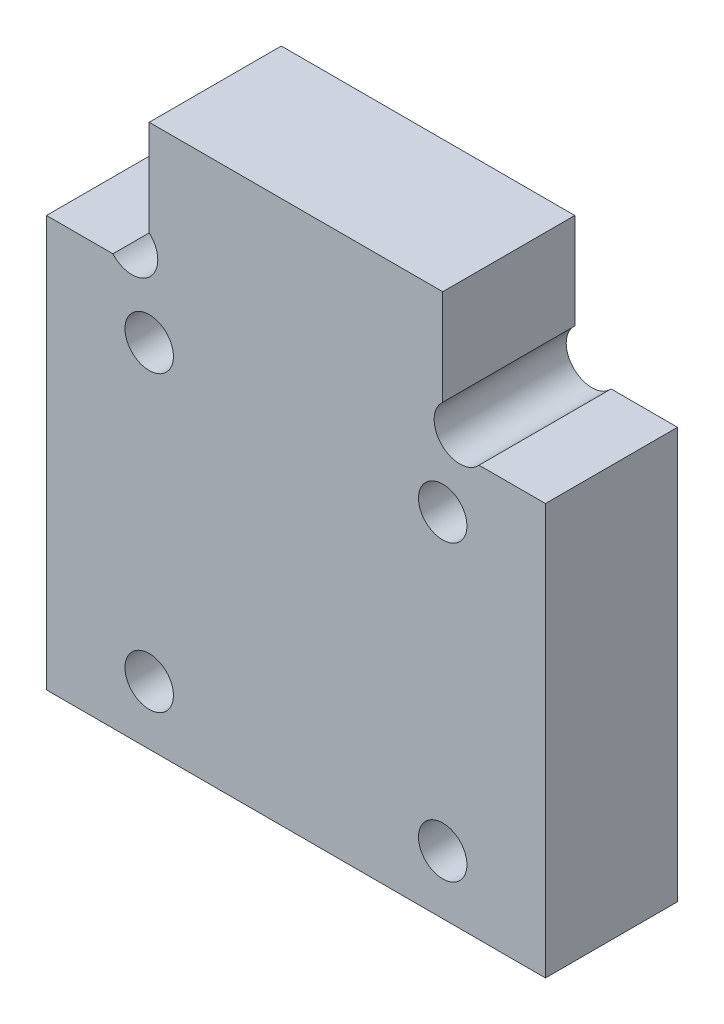
ISO-10303-21;
HEADER;
FILE_DESCRIPTION(('STEP AP214'),'2;1');
FILE_NAME('part.step','',(''),(''),'','','');
FILE_SCHEMA(('AUTOMOTIVE_DESIGN { 1 0 10303 214 1 1 1 1 }'));
ENDSEC;
DATA;
#1=APPLICATION_CONTEXT('core data for automotive mechanical design processes');
#2=APPLICATION_PROTOCOL_DEFINITION('international standard','automotive_design',2000,#1);
#3=PRODUCT_CONTEXT('',#1,'mechanical');
#4=PRODUCT('Part','Part','',(#3));
#5=PRODUCT_RELATED_PRODUCT_CATEGORY('part','',(#4));
#6=PRODUCT_DEFINITION_FORMATION('','',#4);
#7=PRODUCT_DEFINITION_CONTEXT('part definition',#1,'design');
#8=PRODUCT_DEFINITION('design','',#6,#7);
#9=PRODUCT_DEFINITION_SHAPE('','',#8);
#10=(LENGTH_UNIT() NAMED_UNIT(*) SI_UNIT(.MILLI.,.METRE.));
#11=(NAMED_UNIT(*) PLANE_ANGLE_UNIT() SI_UNIT($,.RADIAN.));
#12=(NAMED_UNIT(*) SI_UNIT($,.STERADIAN.) SOLID_ANGLE_UNIT());
#13=UNCERTAINTY_MEASURE_WITH_UNIT(LENGTH_MEASURE(1.E-05),#10,'distance_accuracy_value','');
#14=(GEOMETRIC_REPRESENTATION_CONTEXT(3) GLOBAL_UNCERTAINTY_ASSIGNED_CONTEXT((#13)) GLOBAL_UNIT_ASSIGNED_CONTEXT((#10,
#11,#12)) REPRESENTATION_CONTEXT('',''));
#15=CARTESIAN_POINT('',(0.,0.,0.));
#16=DIRECTION('',(0.,0.,1.));
#17=DIRECTION('',(1.,0.,0.));
#18=AXIS2_PLACEMENT_3D('',#15,#16,#17);
#19=CARTESIAN_POINT('',(0.,28.,9.));
#20=DIRECTION('',(0.,-1.,0.));
#21=DIRECTION('',(0.,0.,-1.));
#22=AXIS2_PLACEMENT_3D('',#19,#20,#21);
#23=PLANE('',#22);
#24=DIRECTION('',(-1.,0.,0.));
#25=VECTOR('',#24,1.);
#26=CARTESIAN_POINT('',(0.,28.,9.));
#27=LINE('',#26,#25);
#28=CARTESIAN_POINT('',(4.52512626584708,28.,9.));
#29=VERTEX_POINT('',#28);
#30=CARTESIAN_POINT('',(0.,28.,9.));
#31=VERTEX_POINT('',#30);
#32=EDGE_CURVE('E128',#29,#31,#27,.T.);
#33=ORIENTED_EDGE('',*,*,#32,.F.);
#34=DIRECTION('',(0.,0.,1.));
#35=VECTOR('',#34,1.);
#36=CARTESIAN_POINT('',(4.52512626584708,28.,0.));
#37=LINE('',#36,#35);
#38=CARTESIAN_POINT('',(4.52512626584708,28.,0.));
#39=VERTEX_POINT('',#38);
#40=EDGE_CURVE('E111',#39,#29,#37,.T.);
#41=ORIENTED_EDGE('',*,*,#40,.F.);
#42=DIRECTION('',(-1.,0.,0.));
#43=VECTOR('',#42,1.);
#44=CARTESIAN_POINT('',(0.,28.,0.));
#45=LINE('',#44,#43);
#46=CARTESIAN_POINT('',(0.,28.,0.));
#47=VERTEX_POINT('',#46);
#48=EDGE_CURVE('E151',#39,#47,#45,.T.);
#49=ORIENTED_EDGE('',*,*,#48,.T.);
#50=DIRECTION('',(0.,0.,-1.));
#51=VECTOR('',#50,1.);
#52=CARTESIAN_POINT('',(0.,28.,9.));
#53=LINE('',#52,#51);
#54=EDGE_CURVE('E134',#31,#47,#53,.T.);
#55=ORIENTED_EDGE('',*,*,#54,.F.);
#56=EDGE_LOOP('',(#33,#41,#49,#55));
#57=FACE_BOUND('',#56,.T.);
#58=ADVANCED_FACE('F33',(#57),#23,.F.);
#59=CARTESIAN_POINT('',(0.,0.,9.));
#60=DIRECTION('',(1.,0.,0.));
#61=DIRECTION('',(0.,0.,-1.));
#62=AXIS2_PLACEMENT_3D('',#59,#60,#61);
#63=PLANE('',#62);
#64=DIRECTION('',(0.,-1.,0.));
#65=VECTOR('',#64,1.);
#66=CARTESIAN_POINT('',(0.,0.,0.));
#67=LINE('',#66,#65);
#68=CARTESIAN_POINT('',(0.,0.,0.));
#69=VERTEX_POINT('',#68);
#70=EDGE_CURVE('E143',#47,#69,#67,.T.);
#71=ORIENTED_EDGE('',*,*,#70,.T.);
#72=DIRECTION('',(0.,0.,-1.));
#73=VECTOR('',#72,1.);
#74=CARTESIAN_POINT('',(0.,0.,9.));
#75=LINE('',#74,#73);
#76=CARTESIAN_POINT('',(0.,0.,9.));
#77=VERTEX_POINT('',#76);
#78=EDGE_CURVE('E11',#77,#69,#75,.T.);
#79=ORIENTED_EDGE('',*,*,#78,.F.);
#80=DIRECTION('',(0.,-1.,0.));
#81=VECTOR('',#80,1.);
#82=CARTESIAN_POINT('',(0.,0.,9.));
#83=LINE('',#82,#81);
#84=EDGE_CURVE('E155',#31,#77,#83,.T.);
#85=ORIENTED_EDGE('',*,*,#84,.F.);
#86=ORIENTED_EDGE('',*,*,#54,.T.);
#87=EDGE_LOOP('',(#71,#79,#85,#86));
#88=FACE_BOUND('',#87,.T.);
#89=ADVANCED_FACE('F35',(#88),#63,.F.);
#90=CARTESIAN_POINT('',(0.,0.,9.));
#91=DIRECTION('',(0.,1.,0.));
#92=DIRECTION('',(0.,0.,1.));
#93=AXIS2_PLACEMENT_3D('',#90,#91,#92);
#94=PLANE('',#93);
#95=DIRECTION('',(1.,0.,0.));
#96=VECTOR('',#95,1.);
#97=CARTESIAN_POINT('',(0.,0.,0.));
#98=LINE('',#97,#96);
#99=CARTESIAN_POINT('',(34.,0.,0.));
#100=VERTEX_POINT('',#99);
#101=EDGE_CURVE('E146',#69,#100,#98,.T.);
#102=ORIENTED_EDGE('',*,*,#101,.T.);
#103=DIRECTION('',(0.,0.,-1.));
#104=VECTOR('',#103,1.);
#105=CARTESIAN_POINT('',(34.,0.,9.));
#106=LINE('',#105,#104);
#107=CARTESIAN_POINT('',(34.,0.,9.));
#108=VERTEX_POINT('',#107);
#109=EDGE_CURVE('E43',#108,#100,#106,.T.);
#110=ORIENTED_EDGE('',*,*,#109,.F.);
#111=DIRECTION('',(1.,0.,0.));
#112=VECTOR('',#111,1.);
#113=CARTESIAN_POINT('',(0.,0.,9.));
#114=LINE('',#113,#112);
#115=EDGE_CURVE('E139',#77,#108,#114,.T.);
#116=ORIENTED_EDGE('',*,*,#115,.F.);
#117=ORIENTED_EDGE('',*,*,#78,.T.);
#118=EDGE_LOOP('',(#102,#110,#116,#117));
#119=FACE_BOUND('',#118,.T.);
#120=ADVANCED_FACE('F264',(#119),#94,.F.);
#121=CARTESIAN_POINT('',(34.,0.,9.));
#122=DIRECTION('',(-1.,0.,0.));
#123=DIRECTION('',(0.,0.,1.));
#124=AXIS2_PLACEMENT_3D('',#121,#122,#123);
#125=PLANE('',#124);
#126=DIRECTION('',(0.,1.,0.));
#127=VECTOR('',#126,1.);
#128=CARTESIAN_POINT('',(34.,0.,0.));
#129=LINE('',#128,#127);
#130=CARTESIAN_POINT('',(34.,28.,0.));
#131=VERTEX_POINT('',#130);
#132=EDGE_CURVE('E149',#100,#131,#129,.T.);
#133=ORIENTED_EDGE('',*,*,#132,.T.);
#134=DIRECTION('',(0.,0.,-1.));
#135=VECTOR('',#134,1.);
#136=CARTESIAN_POINT('',(34.,28.,9.));
#137=LINE('',#136,#135);
#138=CARTESIAN_POINT('',(34.,28.,9.));
#139=VERTEX_POINT('',#138);
#140=EDGE_CURVE('E157',#139,#131,#137,.T.);
#141=ORIENTED_EDGE('',*,*,#140,.F.);
#142=DIRECTION('',(0.,1.,0.));
#143=VECTOR('',#142,1.);
#144=CARTESIAN_POINT('',(34.,0.,9.));
#145=LINE('',#144,#143);
#146=EDGE_CURVE('E137',#108,#139,#145,.T.);
#147=ORIENTED_EDGE('',*,*,#146,.F.);
#148=ORIENTED_EDGE('',*,*,#109,.T.);
#149=EDGE_LOOP('',(#133,#141,#147,#148));
#150=FACE_BOUND('',#149,.T.);
#151=ADVANCED_FACE('F165',(#150),#125,.F.);
#152=CARTESIAN_POINT('',(29.4748737341529,28.,0.));
#153=VERTEX_POINT('',#152);
#154=EDGE_CURVE('E152',#131,#153,#45,.T.);
#155=ORIENTED_EDGE('',*,*,#154,.T.);
#156=DIRECTION('',(0.,0.,1.));
#157=VECTOR('',#156,1.);
#158=CARTESIAN_POINT('',(29.4748737341529,28.,0.));
#159=LINE('',#158,#157);
#160=CARTESIAN_POINT('',(29.4748737341529,28.,9.));
#161=VERTEX_POINT('',#160);
#162=EDGE_CURVE('E69',#153,#161,#159,.T.);
#163=ORIENTED_EDGE('',*,*,#162,.T.);
#164=EDGE_CURVE('E136',#139,#161,#27,.T.);
#165=ORIENTED_EDGE('',*,*,#164,.F.);
#166=ORIENTED_EDGE('',*,*,#140,.T.);
#167=EDGE_LOOP('',(#155,#163,#165,#166));
#168=FACE_BOUND('',#167,.T.);
#169=ADVANCED_FACE('F174',(#168),#23,.F.);
#170=CARTESIAN_POINT('',(0.,0.,9.));
#171=DIRECTION('',(0.,0.,-1.));
#172=DIRECTION('',(-1.,0.,0.));
#173=AXIS2_PLACEMENT_3D('',#170,#171,#172);
#174=PLANE('',#173);
#175=CARTESIAN_POINT('',(27.,24.,9.));
#176=DIRECTION('',(0.,0.,-1.));
#177=DIRECTION('',(-1.,0.,0.));
#178=AXIS2_PLACEMENT_3D('',#175,#176,#177);
#179=CIRCLE('',#178,1.65);
#180=CARTESIAN_POINT('',(25.35,24.,9.));
#181=VERTEX_POINT('',#180);
#182=EDGE_CURVE('E208',#181,#181,#179,.T.);
#183=ORIENTED_EDGE('',*,*,#182,.T.);
#184=EDGE_LOOP('',(#183));
#185=FACE_BOUND('',#184,.T.);
#186=CARTESIAN_POINT('',(27.,4.,9.));
#187=DIRECTION('',(0.,0.,-1.));
#188=DIRECTION('',(-1.,0.,0.));
#189=AXIS2_PLACEMENT_3D('',#186,#187,#188);
#190=CIRCLE('',#189,1.65);
#191=CARTESIAN_POINT('',(25.35,4.,9.));
#192=VERTEX_POINT('',#191);
#193=EDGE_CURVE('E211',#192,#192,#190,.T.);
#194=ORIENTED_EDGE('',*,*,#193,.T.);
#195=EDGE_LOOP('',(#194));
#196=FACE_BOUND('',#195,.T.);
#197=CARTESIAN_POINT('',(7.,4.,9.));
#198=DIRECTION('',(0.,0.,-1.));
#199=DIRECTION('',(-1.,0.,0.));
#200=AXIS2_PLACEMENT_3D('',#197,#198,#199);
#201=CIRCLE('',#200,1.65);
#202=CARTESIAN_POINT('',(5.35,4.,9.));
#203=VERTEX_POINT('',#202);
#204=EDGE_CURVE('E214',#203,#203,#201,.T.);
#205=ORIENTED_EDGE('',*,*,#204,.T.);
#206=EDGE_LOOP('',(#205));
#207=FACE_BOUND('',#206,.T.);
#208=CARTESIAN_POINT('',(7.,24.,9.));
#209=DIRECTION('',(0.,0.,-1.));
#210=DIRECTION('',(-1.,0.,0.));
#211=AXIS2_PLACEMENT_3D('',#208,#209,#210);
#212=CIRCLE('',#211,1.65);
#213=CARTESIAN_POINT('',(5.35,24.,9.));
#214=VERTEX_POINT('',#213);
#215=EDGE_CURVE('E202',#214,#214,#212,.T.);
#216=ORIENTED_EDGE('',*,*,#215,.T.);
#217=EDGE_LOOP('',(#216));
#218=FACE_BOUND('',#217,.T.);
#219=ORIENTED_EDGE('',*,*,#164,.T.);
#220=CARTESIAN_POINT('',(28.1686372883664,29.1686372883664,9.));
#221=DIRECTION('',(0.,0.,1.));
#222=DIRECTION('',(1.,0.,0.));
#223=AXIS2_PLACEMENT_3D('',#220,#221,#222);
#224=CIRCLE('',#223,1.7527027027027);
#225=CARTESIAN_POINT('',(27.,30.4748737341529,9.));
#226=VERTEX_POINT('',#225);
#227=EDGE_CURVE('E37',#226,#161,#224,.T.);
#228=ORIENTED_EDGE('',*,*,#227,.F.);
#229=DIRECTION('',(0.,1.,0.));
#230=VECTOR('',#229,1.);
#231=CARTESIAN_POINT('',(27.,37.,9.));
#232=LINE('',#231,#230);
#233=CARTESIAN_POINT('',(27.,37.,9.));
#234=VERTEX_POINT('',#233);
#235=EDGE_CURVE('E188',#226,#234,#232,.T.);
#236=ORIENTED_EDGE('',*,*,#235,.T.);
#237=DIRECTION('',(-1.,0.,0.));
#238=VECTOR('',#237,1.);
#239=CARTESIAN_POINT('',(27.,37.,9.));
#240=LINE('',#239,#238);
#241=CARTESIAN_POINT('',(7.,37.,9.));
#242=VERTEX_POINT('',#241);
#243=EDGE_CURVE('E185',#234,#242,#240,.T.);
#244=ORIENTED_EDGE('',*,*,#243,.T.);
#245=DIRECTION('',(0.,-1.,0.));
#246=VECTOR('',#245,1.);
#247=CARTESIAN_POINT('',(7.,37.,9.));
#248=LINE('',#247,#246);
#249=CARTESIAN_POINT('',(7.,30.4748737341529,9.));
#250=VERTEX_POINT('',#249);
#251=EDGE_CURVE('E132',#242,#250,#248,.T.);
#252=ORIENTED_EDGE('',*,*,#251,.T.);
#253=CARTESIAN_POINT('',(5.83136271163358,29.1686372883664,9.));
#254=DIRECTION('',(0.,0.,1.));
#255=DIRECTION('',(1.,0.,0.));
#256=AXIS2_PLACEMENT_3D('',#253,#254,#255);
#257=CIRCLE('',#256,1.7527027027027);
#258=EDGE_CURVE('E114',#29,#250,#257,.T.);
#259=ORIENTED_EDGE('',*,*,#258,.F.);
#260=ORIENTED_EDGE('',*,*,#32,.T.);
#261=ORIENTED_EDGE('',*,*,#84,.T.);
#262=ORIENTED_EDGE('',*,*,#115,.T.);
#263=ORIENTED_EDGE('',*,*,#146,.T.);
#264=EDGE_LOOP('',(#219,#228,#236,#244,#252,#259,#260,#261,#262,#263));
#265=FACE_BOUND('',#264,.T.);
#266=ADVANCED_FACE('F126',(#185,#196,#207,#218,#265),#174,.F.);
#267=CARTESIAN_POINT('',(0.,0.,0.));
#268=DIRECTION('',(0.,0.,-1.));
#269=DIRECTION('',(-1.,0.,0.));
#270=AXIS2_PLACEMENT_3D('',#267,#268,#269);
#271=PLANE('',#270);
#272=CARTESIAN_POINT('',(27.,24.,0.));
#273=DIRECTION('',(0.,0.,1.));
#274=DIRECTION('',(-1.,0.,0.));
#275=AXIS2_PLACEMENT_3D('',#272,#273,#274);
#276=CIRCLE('',#275,1.65);
#277=CARTESIAN_POINT('',(25.35,24.,0.));
#278=VERTEX_POINT('',#277);
#279=EDGE_CURVE('E217',#278,#278,#276,.T.);
#280=ORIENTED_EDGE('',*,*,#279,.T.);
#281=EDGE_LOOP('',(#280));
#282=FACE_BOUND('',#281,.T.);
#283=CARTESIAN_POINT('',(27.,4.,0.));
#284=DIRECTION('',(0.,0.,1.));
#285=DIRECTION('',(1.,0.,0.));
#286=AXIS2_PLACEMENT_3D('',#283,#284,#285);
#287=CIRCLE('',#286,1.65);
#288=CARTESIAN_POINT('',(28.65,4.,0.));
#289=VERTEX_POINT('',#288);
#290=EDGE_CURVE('E221',#289,#289,#287,.T.);
#291=ORIENTED_EDGE('',*,*,#290,.T.);
#292=EDGE_LOOP('',(#291));
#293=FACE_BOUND('',#292,.T.);
#294=CARTESIAN_POINT('',(7.,4.,0.));
#295=DIRECTION('',(0.,0.,1.));
#296=DIRECTION('',(-1.,0.,0.));
#297=AXIS2_PLACEMENT_3D('',#294,#295,#296);
#298=CIRCLE('',#297,1.65);
#299=CARTESIAN_POINT('',(5.35,4.,0.));
#300=VERTEX_POINT('',#299);
#301=EDGE_CURVE('E218',#300,#300,#298,.T.);
#302=ORIENTED_EDGE('',*,*,#301,.T.);
#303=EDGE_LOOP('',(#302));
#304=FACE_BOUND('',#303,.T.);
#305=CARTESIAN_POINT('',(7.,24.,0.));
#306=DIRECTION('',(0.,0.,1.));
#307=DIRECTION('',(1.,0.,0.));
#308=AXIS2_PLACEMENT_3D('',#305,#306,#307);
#309=CIRCLE('',#308,1.65);
#310=CARTESIAN_POINT('',(8.65,24.,0.));
#311=VERTEX_POINT('',#310);
#312=EDGE_CURVE('E205',#311,#311,#309,.T.);
#313=ORIENTED_EDGE('',*,*,#312,.T.);
#314=EDGE_LOOP('',(#313));
#315=FACE_BOUND('',#314,.T.);
#316=CARTESIAN_POINT('',(28.1686372883664,29.1686372883664,0.));
#317=DIRECTION('',(0.,0.,1.));
#318=DIRECTION('',(-1.,0.,0.));
#319=AXIS2_PLACEMENT_3D('',#316,#317,#318);
#320=CIRCLE('',#319,1.7527027027027);
#321=CARTESIAN_POINT('',(27.,30.4748737341529,0.));
#322=VERTEX_POINT('',#321);
#323=EDGE_CURVE('E52',#322,#153,#320,.T.);
#324=ORIENTED_EDGE('',*,*,#323,.T.);
#325=ORIENTED_EDGE('',*,*,#154,.F.);
#326=ORIENTED_EDGE('',*,*,#132,.F.);
#327=ORIENTED_EDGE('',*,*,#101,.F.);
#328=ORIENTED_EDGE('',*,*,#70,.F.);
#329=ORIENTED_EDGE('',*,*,#48,.F.);
#330=CARTESIAN_POINT('',(5.83136271163358,29.1686372883664,0.));
#331=DIRECTION('',(0.,0.,1.));
#332=DIRECTION('',(1.,0.,0.));
#333=AXIS2_PLACEMENT_3D('',#330,#331,#332);
#334=CIRCLE('',#333,1.7527027027027);
#335=CARTESIAN_POINT('',(7.,30.4748737341529,0.));
#336=VERTEX_POINT('',#335);
#337=EDGE_CURVE('E117',#39,#336,#334,.T.);
#338=ORIENTED_EDGE('',*,*,#337,.T.);
#339=DIRECTION('',(0.,-1.,0.));
#340=VECTOR('',#339,1.);
#341=CARTESIAN_POINT('',(7.,37.,0.));
#342=LINE('',#341,#340);
#343=CARTESIAN_POINT('',(7.,37.,0.));
#344=VERTEX_POINT('',#343);
#345=EDGE_CURVE('E187',#344,#336,#342,.T.);
#346=ORIENTED_EDGE('',*,*,#345,.F.);
#347=DIRECTION('',(-1.,0.,0.));
#348=VECTOR('',#347,1.);
#349=CARTESIAN_POINT('',(27.,37.,0.));
#350=LINE('',#349,#348);
#351=CARTESIAN_POINT('',(27.,37.,0.));
#352=VERTEX_POINT('',#351);
#353=EDGE_CURVE('E183',#352,#344,#350,.T.);
#354=ORIENTED_EDGE('',*,*,#353,.F.);
#355=DIRECTION('',(0.,1.,0.));
#356=VECTOR('',#355,1.);
#357=CARTESIAN_POINT('',(27.,37.,0.));
#358=LINE('',#357,#356);
#359=EDGE_CURVE('E193',#322,#352,#358,.T.);
#360=ORIENTED_EDGE('',*,*,#359,.F.);
#361=EDGE_LOOP('',(#324,#325,#326,#327,#328,#329,#338,#346,#354,#360));
#362=FACE_BOUND('',#361,.T.);
#363=ADVANCED_FACE('F170',(#282,#293,#304,#315,#362),#271,.T.);
#364=CARTESIAN_POINT('',(7.,37.,0.));
#365=DIRECTION('',(-1.,0.,0.));
#366=DIRECTION('',(0.,0.,1.));
#367=AXIS2_PLACEMENT_3D('',#364,#365,#366);
#368=PLANE('',#367);
#369=DIRECTION('',(0.,0.,1.));
#370=VECTOR('',#369,1.);
#371=CARTESIAN_POINT('',(7.,30.4748737341529,0.));
#372=LINE('',#371,#370);
#373=EDGE_CURVE('E121',#336,#250,#372,.T.);
#374=ORIENTED_EDGE('',*,*,#373,.T.);
#375=ORIENTED_EDGE('',*,*,#251,.F.);
#376=DIRECTION('',(0.,0.,1.));
#377=VECTOR('',#376,1.);
#378=CARTESIAN_POINT('',(7.,37.,0.));
#379=LINE('',#378,#377);
#380=EDGE_CURVE('E147',#344,#242,#379,.T.);
#381=ORIENTED_EDGE('',*,*,#380,.F.);
#382=ORIENTED_EDGE('',*,*,#345,.T.);
#383=EDGE_LOOP('',(#374,#375,#381,#382));
#384=FACE_BOUND('',#383,.T.);
#385=ADVANCED_FACE('F281',(#384),#368,.T.);
#386=CARTESIAN_POINT('',(27.,37.,0.));
#387=DIRECTION('',(0.,1.,0.));
#388=DIRECTION('',(0.,0.,1.));
#389=AXIS2_PLACEMENT_3D('',#386,#387,#388);
#390=PLANE('',#389);
#391=ORIENTED_EDGE('',*,*,#243,.F.);
#392=DIRECTION('',(0.,0.,1.));
#393=VECTOR('',#392,1.);
#394=CARTESIAN_POINT('',(27.,37.,0.));
#395=LINE('',#394,#393);
#396=EDGE_CURVE('E180',#352,#234,#395,.T.);
#397=ORIENTED_EDGE('',*,*,#396,.F.);
#398=ORIENTED_EDGE('',*,*,#353,.T.);
#399=ORIENTED_EDGE('',*,*,#380,.T.);
#400=EDGE_LOOP('',(#391,#397,#398,#399));
#401=FACE_BOUND('',#400,.T.);
#402=ADVANCED_FACE('F284',(#401),#390,.T.);
#403=CARTESIAN_POINT('',(27.,37.,0.));
#404=DIRECTION('',(1.,0.,0.));
#405=DIRECTION('',(0.,0.,-1.));
#406=AXIS2_PLACEMENT_3D('',#403,#404,#405);
#407=PLANE('',#406);
#408=DIRECTION('',(0.,0.,1.));
#409=VECTOR('',#408,1.);
#410=CARTESIAN_POINT('',(27.,30.4748737341529,0.));
#411=LINE('',#410,#409);
#412=EDGE_CURVE('E61',#322,#226,#411,.T.);
#413=ORIENTED_EDGE('',*,*,#412,.F.);
#414=ORIENTED_EDGE('',*,*,#359,.T.);
#415=ORIENTED_EDGE('',*,*,#396,.T.);
#416=ORIENTED_EDGE('',*,*,#235,.F.);
#417=EDGE_LOOP('',(#413,#414,#415,#416));
#418=FACE_BOUND('',#417,.T.);
#419=ADVANCED_FACE('F287',(#418),#407,.T.);
#420=CARTESIAN_POINT('',(5.83136271163358,29.1686372883664,0.));
#421=DIRECTION('',(0.,0.,1.));
#422=DIRECTION('',(1.,0.,0.));
#423=AXIS2_PLACEMENT_3D('',#420,#421,#422);
#424=CYLINDRICAL_SURFACE('',#423,1.7527027027027);
#425=ORIENTED_EDGE('',*,*,#373,.F.);
#426=ORIENTED_EDGE('',*,*,#337,.F.);
#427=ORIENTED_EDGE('',*,*,#40,.T.);
#428=ORIENTED_EDGE('',*,*,#258,.T.);
#429=EDGE_LOOP('',(#425,#426,#427,#428));
#430=FACE_BOUND('',#429,.T.);
#431=ADVANCED_FACE('F113',(#430),#424,.F.);
#432=CARTESIAN_POINT('',(28.1686372883664,29.1686372883664,0.));
#433=DIRECTION('',(0.,0.,1.));
#434=DIRECTION('',(1.,0.,0.));
#435=AXIS2_PLACEMENT_3D('',#432,#433,#434);
#436=CYLINDRICAL_SURFACE('',#435,1.7527027027027);
#437=ORIENTED_EDGE('',*,*,#162,.F.);
#438=ORIENTED_EDGE('',*,*,#323,.F.);
#439=ORIENTED_EDGE('',*,*,#412,.T.);
#440=ORIENTED_EDGE('',*,*,#227,.T.);
#441=EDGE_LOOP('',(#437,#438,#439,#440));
#442=FACE_BOUND('',#441,.T.);
#443=ADVANCED_FACE('F248',(#442),#436,.F.);
#444=CARTESIAN_POINT('',(7.,24.,0.));
#445=DIRECTION('',(0.,0.,1.));
#446=DIRECTION('',(1.,0.,0.));
#447=AXIS2_PLACEMENT_3D('',#444,#445,#446);
#448=CYLINDRICAL_SURFACE('',#447,1.65);
#449=ORIENTED_EDGE('',*,*,#312,.F.);
#450=EDGE_LOOP('',(#449));
#451=FACE_BOUND('',#450,.T.);
#452=ORIENTED_EDGE('',*,*,#215,.F.);
#453=EDGE_LOOP('',(#452));
#454=FACE_BOUND('',#453,.T.);
#455=ADVANCED_FACE('F245',(#451,#454),#448,.F.);
#456=CARTESIAN_POINT('',(7.,4.,0.));
#457=DIRECTION('',(0.,0.,1.));
#458=DIRECTION('',(1.,0.,0.));
#459=AXIS2_PLACEMENT_3D('',#456,#457,#458);
#460=CYLINDRICAL_SURFACE('',#459,1.65);
#461=ORIENTED_EDGE('',*,*,#301,.F.);
#462=EDGE_LOOP('',(#461));
#463=FACE_BOUND('',#462,.T.);
#464=ORIENTED_EDGE('',*,*,#204,.F.);
#465=EDGE_LOOP('',(#464));
#466=FACE_BOUND('',#465,.T.);
#467=ADVANCED_FACE('F247',(#463,#466),#460,.F.);
#468=CARTESIAN_POINT('',(27.,4.,0.));
#469=DIRECTION('',(0.,0.,1.));
#470=DIRECTION('',(1.,0.,0.));
#471=AXIS2_PLACEMENT_3D('',#468,#469,#470);
#472=CYLINDRICAL_SURFACE('',#471,1.65);
#473=ORIENTED_EDGE('',*,*,#290,.F.);
#474=EDGE_LOOP('',(#473));
#475=FACE_BOUND('',#474,.T.);
#476=ORIENTED_EDGE('',*,*,#193,.F.);
#477=EDGE_LOOP('',(#476));
#478=FACE_BOUND('',#477,.T.);
#479=ADVANCED_FACE('F232',(#475,#478),#472,.F.);
#480=CARTESIAN_POINT('',(27.,24.,0.));
#481=DIRECTION('',(0.,0.,1.));
#482=DIRECTION('',(1.,0.,0.));
#483=AXIS2_PLACEMENT_3D('',#480,#481,#482);
#484=CYLINDRICAL_SURFACE('',#483,1.65);
#485=ORIENTED_EDGE('',*,*,#279,.F.);
#486=EDGE_LOOP('',(#485));
#487=FACE_BOUND('',#486,.T.);
#488=ORIENTED_EDGE('',*,*,#182,.F.);
#489=EDGE_LOOP('',(#488));
#490=FACE_BOUND('',#489,.T.);
#491=ADVANCED_FACE('F229',(#487,#490),#484,.F.);
#492=CLOSED_SHELL('',(#58,#89,#120,#151,#169,#266,#363,#385,#402,#419,#431,#443,#455,#467,#479,#491));
#493=MANIFOLD_SOLID_BREP('B2',#492);
#494=ADVANCED_BREP_SHAPE_REPRESENTATION('',(#18,#493),#14);
#495=SHAPE_DEFINITION_REPRESENTATION(#9,#494);
ENDSEC;
END-ISO-10303-21;
